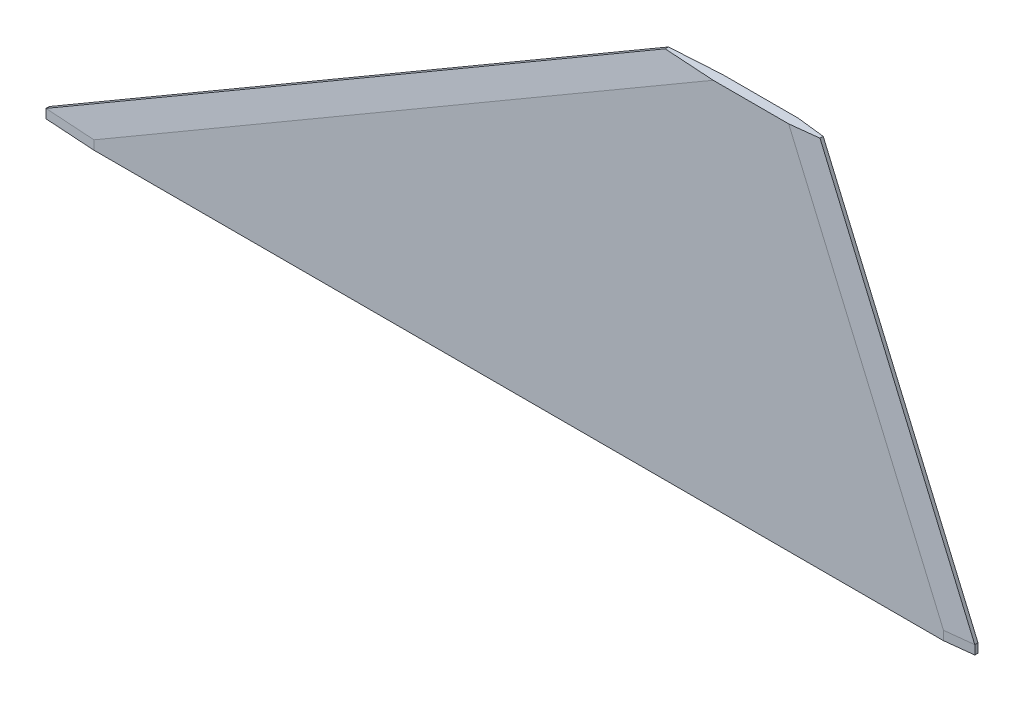
ISO-10303-21;
HEADER;
FILE_DESCRIPTION(('STEP AP214'),'2;1');
FILE_NAME('part.step','',(''),(''),'','','');
FILE_SCHEMA(('AUTOMOTIVE_DESIGN { 1 0 10303 214 1 1 1 1 }'));
ENDSEC;
DATA;
#1=APPLICATION_CONTEXT('core data for automotive mechanical design processes');
#2=APPLICATION_PROTOCOL_DEFINITION('international standard','automotive_design',2000,#1);
#3=PRODUCT_CONTEXT('',#1,'mechanical');
#4=PRODUCT('Part','Part','',(#3));
#5=PRODUCT_RELATED_PRODUCT_CATEGORY('part','',(#4));
#6=PRODUCT_DEFINITION_FORMATION('','',#4);
#7=PRODUCT_DEFINITION_CONTEXT('part definition',#1,'design');
#8=PRODUCT_DEFINITION('design','',#6,#7);
#9=PRODUCT_DEFINITION_SHAPE('','',#8);
#10=(LENGTH_UNIT() NAMED_UNIT(*) SI_UNIT(.MILLI.,.METRE.));
#11=(NAMED_UNIT(*) PLANE_ANGLE_UNIT() SI_UNIT($,.RADIAN.));
#12=(NAMED_UNIT(*) SI_UNIT($,.STERADIAN.) SOLID_ANGLE_UNIT());
#13=UNCERTAINTY_MEASURE_WITH_UNIT(LENGTH_MEASURE(1.E-05),#10,'distance_accuracy_value','');
#14=(GEOMETRIC_REPRESENTATION_CONTEXT(3) GLOBAL_UNCERTAINTY_ASSIGNED_CONTEXT((#13)) GLOBAL_UNIT_ASSIGNED_CONTEXT((#10,
#11,#12)) REPRESENTATION_CONTEXT('',''));
#15=CARTESIAN_POINT('',(0.,0.,0.));
#16=DIRECTION('',(0.,0.,1.));
#17=DIRECTION('',(1.,0.,0.));
#18=AXIS2_PLACEMENT_3D('',#15,#16,#17);
#19=CARTESIAN_POINT('',(304.8,177.8,4.7625));
#20=DIRECTION('',(0.503871025524086,-0.863778900898433,0.));
#21=DIRECTION('',(0.863778900898433,0.503871025524086,0.));
#22=AXIS2_PLACEMENT_3D('',#19,#20,#21);
#23=PLANE('',#22);
#24=DIRECTION('',(0.,0.,-1.));
#25=VECTOR('',#24,1.);
#26=CARTESIAN_POINT('',(304.8,177.8,4.7625));
#27=LINE('',#26,#25);
#28=CARTESIAN_POINT('',(304.8,177.8,3.17499999999999));
#29=VERTEX_POINT('',#28);
#30=CARTESIAN_POINT('',(304.8,177.8,1.5875));
#31=VERTEX_POINT('',#30);
#32=EDGE_CURVE('E158',#29,#31,#27,.T.);
#33=ORIENTED_EDGE('',*,*,#32,.T.);
#34=DIRECTION('',(-0.863778900898433,-0.503871025524086,0.));
#35=VECTOR('',#34,1.);
#36=CARTESIAN_POINT('',(0.,0.,1.5875));
#37=LINE('',#36,#35);
#38=CARTESIAN_POINT('',(0.,0.,1.5875));
#39=VERTEX_POINT('',#38);
#40=EDGE_CURVE('E172',#31,#39,#37,.T.);
#41=ORIENTED_EDGE('',*,*,#40,.T.);
#42=DIRECTION('',(0.,0.,-1.));
#43=VECTOR('',#42,1.);
#44=CARTESIAN_POINT('',(0.,0.,4.7625));
#45=LINE('',#44,#43);
#46=CARTESIAN_POINT('',(0.,0.,3.17499999999999));
#47=VERTEX_POINT('',#46);
#48=EDGE_CURVE('E167',#47,#39,#45,.T.);
#49=ORIENTED_EDGE('',*,*,#48,.F.);
#50=DIRECTION('',(0.863778900898433,0.503871025524086,0.));
#51=VECTOR('',#50,1.);
#52=CARTESIAN_POINT('',(304.8,177.8,3.17499999999999));
#53=LINE('',#52,#51);
#54=EDGE_CURVE('E170',#47,#29,#53,.T.);
#55=ORIENTED_EDGE('',*,*,#54,.T.);
#56=EDGE_LOOP('',(#33,#41,#49,#55));
#57=FACE_BOUND('',#56,.T.);
#58=ADVANCED_FACE('F38',(#57),#23,.F.);
#59=CARTESIAN_POINT('',(457.2,0.,4.7625));
#60=DIRECTION('',(-0.919145030018058,-0.393919298579168,0.));
#61=DIRECTION('',(0.393919298579168,-0.919145030018058,0.));
#62=AXIS2_PLACEMENT_3D('',#59,#60,#61);
#63=PLANE('',#62);
#64=DIRECTION('',(0.,0.,-1.));
#65=VECTOR('',#64,1.);
#66=CARTESIAN_POINT('',(457.2,0.,4.7625));
#67=LINE('',#66,#65);
#68=CARTESIAN_POINT('',(457.2,0.,3.17499999999998));
#69=VERTEX_POINT('',#68);
#70=CARTESIAN_POINT('',(457.2,0.,1.5875));
#71=VERTEX_POINT('',#70);
#72=EDGE_CURVE('E165',#69,#71,#67,.T.);
#73=ORIENTED_EDGE('',*,*,#72,.T.);
#74=DIRECTION('',(-0.393919298579168,0.919145030018058,0.));
#75=VECTOR('',#74,1.);
#76=CARTESIAN_POINT('',(381.,177.8,1.5875));
#77=LINE('',#76,#75);
#78=CARTESIAN_POINT('',(381.,177.8,1.5875));
#79=VERTEX_POINT('',#78);
#80=EDGE_CURVE('E191',#71,#79,#77,.T.);
#81=ORIENTED_EDGE('',*,*,#80,.T.);
#82=DIRECTION('',(0.,0.,-1.));
#83=VECTOR('',#82,1.);
#84=CARTESIAN_POINT('',(381.,177.8,4.7625));
#85=LINE('',#84,#83);
#86=CARTESIAN_POINT('',(381.,177.8,3.17499999999998));
#87=VERTEX_POINT('',#86);
#88=EDGE_CURVE('E162',#87,#79,#85,.T.);
#89=ORIENTED_EDGE('',*,*,#88,.F.);
#90=DIRECTION('',(0.393919298579168,-0.919145030018058,0.));
#91=VECTOR('',#90,1.);
#92=CARTESIAN_POINT('',(457.2,0.,3.17499999999998));
#93=LINE('',#92,#91);
#94=EDGE_CURVE('E189',#87,#69,#93,.T.);
#95=ORIENTED_EDGE('',*,*,#94,.T.);
#96=EDGE_LOOP('',(#73,#81,#89,#95));
#97=FACE_BOUND('',#96,.T.);
#98=ADVANCED_FACE('F267',(#97),#63,.F.);
#99=CARTESIAN_POINT('',(381.,177.8,4.7625));
#100=DIRECTION('',(0.,-1.,0.));
#101=DIRECTION('',(0.,0.,-1.));
#102=AXIS2_PLACEMENT_3D('',#99,#100,#101);
#103=PLANE('',#102);
#104=ORIENTED_EDGE('',*,*,#88,.T.);
#105=DIRECTION('',(-0.993464418144731,0.,-0.114142235304689));
#106=VECTOR('',#105,1.);
#107=CARTESIAN_POINT('',(456.207232119117,177.8,10.2282942029627));
#108=LINE('',#107,#106);
#109=CARTESIAN_POINT('',(367.18281165079,177.8,0.));
#110=VERTEX_POINT('',#109);
#111=EDGE_CURVE('E196',#79,#110,#108,.T.);
#112=ORIENTED_EDGE('',*,*,#111,.T.);
#113=DIRECTION('',(-1.,0.,0.));
#114=VECTOR('',#113,1.);
#115=CARTESIAN_POINT('',(381.,177.8,0.));
#116=LINE('',#115,#114);
#117=CARTESIAN_POINT('',(330.004862666573,177.8,0.));
#118=VERTEX_POINT('',#117);
#119=EDGE_CURVE('E150',#110,#118,#116,.T.);
#120=ORIENTED_EDGE('',*,*,#119,.T.);
#121=DIRECTION('',(-0.998022397418784,0.,0.0628593211104263));
#122=VECTOR('',#121,1.);
#123=CARTESIAN_POINT('',(304.8,177.8,1.5875));
#124=LINE('',#123,#122);
#125=EDGE_CURVE('E184',#118,#31,#124,.T.);
#126=ORIENTED_EDGE('',*,*,#125,.T.);
#127=ORIENTED_EDGE('',*,*,#32,.F.);
#128=DIRECTION('',(-0.998022397418784,0.,-0.0628593211104246));
#129=VECTOR('',#128,1.);
#130=CARTESIAN_POINT('',(7.67782336852167,177.8,-15.538906980656));
#131=LINE('',#130,#129);
#132=CARTESIAN_POINT('',(330.004862666574,177.8,4.7625));
#133=VERTEX_POINT('',#132);
#134=EDGE_CURVE('E181',#29,#133,#131,.F.);
#135=ORIENTED_EDGE('',*,*,#134,.T.);
#136=DIRECTION('',(-1.,0.,0.));
#137=VECTOR('',#136,1.);
#138=CARTESIAN_POINT('',(381.,177.8,4.7625));
#139=LINE('',#138,#137);
#140=CARTESIAN_POINT('',(367.182811650789,177.8,4.7625));
#141=VERTEX_POINT('',#140);
#142=EDGE_CURVE('E152',#141,#133,#139,.T.);
#143=ORIENTED_EDGE('',*,*,#142,.F.);
#144=DIRECTION('',(-0.993464418144731,0.,0.114142235304686));
#145=VECTOR('',#144,1.);
#146=CARTESIAN_POINT('',(374.485630180208,177.8,3.9234563304451));
#147=LINE('',#146,#145);
#148=EDGE_CURVE('E194',#141,#87,#147,.F.);
#149=ORIENTED_EDGE('',*,*,#148,.T.);
#150=EDGE_LOOP('',(#104,#112,#120,#126,#127,#135,#143,#149));
#151=FACE_BOUND('',#150,.T.);
#152=ADVANCED_FACE('F260',(#151),#103,.F.);
#153=CARTESIAN_POINT('',(0.,0.,4.7625));
#154=DIRECTION('',(0.,0.,-1.));
#155=DIRECTION('',(-1.,0.,0.));
#156=AXIS2_PLACEMENT_3D('',#153,#154,#155);
#157=PLANE('',#156);
#158=DIRECTION('',(-0.863778900898433,-0.503871025524086,0.));
#159=VECTOR('',#158,1.);
#160=CARTESIAN_POINT('',(6.39916202415609,-10.9699920414104,4.7625));
#161=LINE('',#160,#159);
#162=CARTESIAN_POINT('',(25.204862666574,0.,4.7625));
#163=VERTEX_POINT('',#162);
#164=EDGE_CURVE('E186',#133,#163,#161,.T.);
#165=ORIENTED_EDGE('',*,*,#164,.T.);
#166=DIRECTION('',(0.,1.,0.));
#167=VECTOR('',#166,1.);
#168=CARTESIAN_POINT('',(25.204862666574,-4.445,4.7625));
#169=LINE('',#168,#167);
#170=CARTESIAN_POINT('',(25.204862666574,-4.445,4.7625));
#171=VERTEX_POINT('',#170);
#172=EDGE_CURVE('E220',#171,#163,#169,.T.);
#173=ORIENTED_EDGE('',*,*,#172,.F.);
#174=DIRECTION('',(-1.,0.,0.));
#175=VECTOR('',#174,1.);
#176=CARTESIAN_POINT('',(443.382811650789,-4.445,4.7625));
#177=LINE('',#176,#175);
#178=CARTESIAN_POINT('',(443.382811650789,-4.445,4.7625));
#179=VERTEX_POINT('',#178);
#180=EDGE_CURVE('E231',#179,#171,#177,.T.);
#181=ORIENTED_EDGE('',*,*,#180,.F.);
#182=DIRECTION('',(0.,1.,0.));
#183=VECTOR('',#182,1.);
#184=CARTESIAN_POINT('',(443.382811650789,-4.445,4.7625));
#185=LINE('',#184,#183);
#186=CARTESIAN_POINT('',(443.382811650789,0.,4.7625));
#187=VERTEX_POINT('',#186);
#188=EDGE_CURVE('E215',#179,#187,#185,.T.);
#189=ORIENTED_EDGE('',*,*,#188,.T.);
#190=DIRECTION('',(-0.393919298579168,0.919145030018058,0.));
#191=VECTOR('',#190,1.);
#192=CARTESIAN_POINT('',(374.582030532563,160.535155942527,4.7625));
#193=LINE('',#192,#191);
#194=EDGE_CURVE('E11',#187,#141,#193,.T.);
#195=ORIENTED_EDGE('',*,*,#194,.T.);
#196=ORIENTED_EDGE('',*,*,#142,.T.);
#197=EDGE_LOOP('',(#165,#173,#181,#189,#195,#196));
#198=FACE_BOUND('',#197,.T.);
#199=ADVANCED_FACE('F243',(#198),#157,.F.);
#200=CARTESIAN_POINT('',(0.,0.,0.));
#201=DIRECTION('',(0.,0.,-1.));
#202=DIRECTION('',(-1.,0.,0.));
#203=AXIS2_PLACEMENT_3D('',#200,#201,#202);
#204=PLANE('',#203);
#205=ORIENTED_EDGE('',*,*,#119,.F.);
#206=DIRECTION('',(0.393919298579168,-0.919145030018058,0.));
#207=VECTOR('',#206,1.);
#208=CARTESIAN_POINT('',(445.526858118771,-5.00277509195542,0.));
#209=LINE('',#208,#207);
#210=CARTESIAN_POINT('',(443.38281165079,0.,0.));
#211=VERTEX_POINT('',#210);
#212=EDGE_CURVE('E59',#110,#211,#209,.T.);
#213=ORIENTED_EDGE('',*,*,#212,.T.);
#214=DIRECTION('',(0.,1.,0.));
#215=VECTOR('',#214,1.);
#216=CARTESIAN_POINT('',(443.38281165079,-4.445,0.));
#217=LINE('',#216,#215);
#218=CARTESIAN_POINT('',(443.38281165079,-4.445,0.));
#219=VERTEX_POINT('',#218);
#220=EDGE_CURVE('E134',#219,#211,#217,.T.);
#221=ORIENTED_EDGE('',*,*,#220,.F.);
#222=DIRECTION('',(1.,0.,0.));
#223=VECTOR('',#222,1.);
#224=CARTESIAN_POINT('',(25.2048626665733,-4.445,0.));
#225=LINE('',#224,#223);
#226=CARTESIAN_POINT('',(25.2048626665733,-4.445,0.));
#227=VERTEX_POINT('',#226);
#228=EDGE_CURVE('E126',#227,#219,#225,.T.);
#229=ORIENTED_EDGE('',*,*,#228,.F.);
#230=DIRECTION('',(0.,1.,0.));
#231=VECTOR('',#230,1.);
#232=CARTESIAN_POINT('',(25.2048626665733,-4.445,0.));
#233=LINE('',#232,#231);
#234=CARTESIAN_POINT('',(25.2048626665733,0.,0.));
#235=VERTEX_POINT('',#234);
#236=EDGE_CURVE('E131',#227,#235,#233,.T.);
#237=ORIENTED_EDGE('',*,*,#236,.T.);
#238=DIRECTION('',(0.863778900898433,0.503871025524086,0.));
#239=VECTOR('',#238,1.);
#240=CARTESIAN_POINT('',(311.199162024156,166.83000795859,0.));
#241=LINE('',#240,#239);
#242=EDGE_CURVE('E179',#235,#118,#241,.T.);
#243=ORIENTED_EDGE('',*,*,#242,.T.);
#244=EDGE_LOOP('',(#205,#213,#221,#229,#237,#243));
#245=FACE_BOUND('',#244,.T.);
#246=ADVANCED_FACE('F128',(#245),#204,.T.);
#247=CARTESIAN_POINT('',(304.8,177.8,1.5875));
#248=DIRECTION('',(-0.0624975089180724,0.107138586716695,-0.992277876713668));
#249=DIRECTION('',(0.863778900898433,0.503871025524086,0.));
#250=AXIS2_PLACEMENT_3D('',#247,#248,#249);
#251=PLANE('',#250);
#252=ORIENTED_EDGE('',*,*,#125,.F.);
#253=ORIENTED_EDGE('',*,*,#242,.F.);
#254=DIRECTION('',(0.998022397418784,0.,-0.0628593211104263));
#255=VECTOR('',#254,1.);
#256=CARTESIAN_POINT('',(303.595645512459,0.,-17.5341311561262));
#257=LINE('',#256,#255);
#258=EDGE_CURVE('E149',#39,#235,#257,.T.);
#259=ORIENTED_EDGE('',*,*,#258,.F.);
#260=ORIENTED_EDGE('',*,*,#40,.F.);
#261=EDGE_LOOP('',(#252,#253,#259,#260));
#262=FACE_BOUND('',#261,.T.);
#263=ADVANCED_FACE('F263',(#262),#251,.T.);
#264=CARTESIAN_POINT('',(6.39916202415609,-10.9699920414104,4.7625));
#265=DIRECTION('',(0.0624975089180707,-0.107138586716693,-0.992277876713668));
#266=DIRECTION('',(-0.863778900898433,-0.503871025524086,0.));
#267=AXIS2_PLACEMENT_3D('',#264,#265,#266);
#268=PLANE('',#267);
#269=ORIENTED_EDGE('',*,*,#134,.F.);
#270=ORIENTED_EDGE('',*,*,#54,.F.);
#271=DIRECTION('',(0.998022397418784,0.,0.0628593211104246));
#272=VECTOR('',#271,1.);
#273=CARTESIAN_POINT('',(6.47346888098041,0.,3.58272417546972));
#274=LINE('',#273,#272);
#275=EDGE_CURVE('E175',#163,#47,#274,.F.);
#276=ORIENTED_EDGE('',*,*,#275,.F.);
#277=ORIENTED_EDGE('',*,*,#164,.F.);
#278=EDGE_LOOP('',(#269,#270,#276,#277));
#279=FACE_BOUND('',#278,.T.);
#280=ADVANCED_FACE('F256',(#279),#268,.F.);
#281=CARTESIAN_POINT('',(457.2,0.,1.5875));
#282=DIRECTION('',(0.11400590984728,0.0488596756488344,-0.992277876713668));
#283=DIRECTION('',(0.393919298579168,-0.919145030018058,0.));
#284=AXIS2_PLACEMENT_3D('',#281,#282,#283);
#285=PLANE('',#284);
#286=DIRECTION('',(0.993464418144731,0.,0.114142235304689));
#287=VECTOR('',#286,1.);
#288=CARTESIAN_POINT('',(457.2,0.,1.5875));
#289=LINE('',#288,#287);
#290=EDGE_CURVE('E46',#211,#71,#289,.T.);
#291=ORIENTED_EDGE('',*,*,#290,.F.);
#292=ORIENTED_EDGE('',*,*,#212,.F.);
#293=ORIENTED_EDGE('',*,*,#111,.F.);
#294=ORIENTED_EDGE('',*,*,#80,.F.);
#295=EDGE_LOOP('',(#291,#292,#293,#294));
#296=FACE_BOUND('',#295,.T.);
#297=ADVANCED_FACE('F264',(#296),#285,.T.);
#298=CARTESIAN_POINT('',(374.582030532563,160.535155942527,4.7625));
#299=DIRECTION('',(-0.114005909847277,-0.0488596756488329,-0.992277876713668));
#300=DIRECTION('',(-0.393919298579168,0.919145030018058,0.));
#301=AXIS2_PLACEMENT_3D('',#298,#299,#300);
#302=PLANE('',#301);
#303=DIRECTION('',(0.993464418144731,0.,-0.114142235304686));
#304=VECTOR('',#303,1.);
#305=CARTESIAN_POINT('',(375.478398061091,0.,12.5642505334075));
#306=LINE('',#305,#304);
#307=EDGE_CURVE('E199',#69,#187,#306,.F.);
#308=ORIENTED_EDGE('',*,*,#307,.F.);
#309=ORIENTED_EDGE('',*,*,#94,.F.);
#310=ORIENTED_EDGE('',*,*,#148,.F.);
#311=ORIENTED_EDGE('',*,*,#194,.F.);
#312=EDGE_LOOP('',(#308,#309,#310,#311));
#313=FACE_BOUND('',#312,.T.);
#314=ADVANCED_FACE('F40',(#313),#302,.F.);
#315=CARTESIAN_POINT('',(0.,-4.445,1.5875));
#316=DIRECTION('',(0.0628593211104259,0.,0.998022397418784));
#317=DIRECTION('',(0.998022397418784,0.,-0.0628593211104259));
#318=AXIS2_PLACEMENT_3D('',#315,#316,#317);
#319=PLANE('',#318);
#320=ORIENTED_EDGE('',*,*,#258,.T.);
#321=ORIENTED_EDGE('',*,*,#236,.F.);
#322=DIRECTION('',(0.998022397418784,0.,-0.0628593211104259));
#323=VECTOR('',#322,1.);
#324=CARTESIAN_POINT('',(0.,-4.445,1.5875));
#325=LINE('',#324,#323);
#326=CARTESIAN_POINT('',(0.,-4.445,1.5875));
#327=VERTEX_POINT('',#326);
#328=EDGE_CURVE('E138',#327,#227,#325,.T.);
#329=ORIENTED_EDGE('',*,*,#328,.F.);
#330=DIRECTION('',(0.,1.,0.));
#331=VECTOR('',#330,1.);
#332=CARTESIAN_POINT('',(0.,-4.445,1.5875));
#333=LINE('',#332,#331);
#334=EDGE_CURVE('E226',#327,#39,#333,.T.);
#335=ORIENTED_EDGE('',*,*,#334,.T.);
#336=EDGE_LOOP('',(#320,#321,#329,#335));
#337=FACE_BOUND('',#336,.T.);
#338=ADVANCED_FACE('F148',(#337),#319,.F.);
#339=CARTESIAN_POINT('',(443.38281165079,-4.445,0.));
#340=DIRECTION('',(-0.114142235304689,0.,0.993464418144731));
#341=DIRECTION('',(0.993464418144731,0.,0.114142235304689));
#342=AXIS2_PLACEMENT_3D('',#339,#340,#341);
#343=PLANE('',#342);
#344=ORIENTED_EDGE('',*,*,#290,.T.);
#345=DIRECTION('',(0.,1.,0.));
#346=VECTOR('',#345,1.);
#347=CARTESIAN_POINT('',(457.2,-4.445,1.5875));
#348=LINE('',#347,#346);
#349=CARTESIAN_POINT('',(457.2,-4.445,1.5875));
#350=VERTEX_POINT('',#349);
#351=EDGE_CURVE('E154',#350,#71,#348,.T.);
#352=ORIENTED_EDGE('',*,*,#351,.F.);
#353=DIRECTION('',(0.993464418144731,0.,0.114142235304689));
#354=VECTOR('',#353,1.);
#355=CARTESIAN_POINT('',(443.38281165079,-4.445,0.));
#356=LINE('',#355,#354);
#357=EDGE_CURVE('E137',#219,#350,#356,.T.);
#358=ORIENTED_EDGE('',*,*,#357,.F.);
#359=ORIENTED_EDGE('',*,*,#220,.T.);
#360=EDGE_LOOP('',(#344,#352,#358,#359));
#361=FACE_BOUND('',#360,.T.);
#362=ADVANCED_FACE('F204',(#361),#343,.F.);
#363=CARTESIAN_POINT('',(457.2,-4.445,1.5875));
#364=DIRECTION('',(-1.,0.,0.));
#365=DIRECTION('',(0.,0.,1.));
#366=AXIS2_PLACEMENT_3D('',#363,#364,#365);
#367=PLANE('',#366);
#368=ORIENTED_EDGE('',*,*,#72,.F.);
#369=DIRECTION('',(0.,1.,0.));
#370=VECTOR('',#369,1.);
#371=CARTESIAN_POINT('',(457.2,-4.445,3.17499999999998));
#372=LINE('',#371,#370);
#373=CARTESIAN_POINT('',(457.2,-4.445,3.17499999999998));
#374=VERTEX_POINT('',#373);
#375=EDGE_CURVE('E214',#374,#69,#372,.T.);
#376=ORIENTED_EDGE('',*,*,#375,.F.);
#377=DIRECTION('',(0.,0.,1.));
#378=VECTOR('',#377,1.);
#379=CARTESIAN_POINT('',(457.2,-4.445,1.5875));
#380=LINE('',#379,#378);
#381=EDGE_CURVE('E213',#350,#374,#380,.T.);
#382=ORIENTED_EDGE('',*,*,#381,.F.);
#383=ORIENTED_EDGE('',*,*,#351,.T.);
#384=EDGE_LOOP('',(#368,#376,#382,#383));
#385=FACE_BOUND('',#384,.T.);
#386=ADVANCED_FACE('F210',(#385),#367,.F.);
#387=CARTESIAN_POINT('',(457.2,-4.445,3.17499999999998));
#388=DIRECTION('',(-0.114142235304686,0.,-0.993464418144731));
#389=DIRECTION('',(-0.993464418144732,0.,0.114142235304686));
#390=AXIS2_PLACEMENT_3D('',#387,#388,#389);
#391=PLANE('',#390);
#392=ORIENTED_EDGE('',*,*,#307,.T.);
#393=ORIENTED_EDGE('',*,*,#188,.F.);
#394=DIRECTION('',(-0.993464418144731,0.,0.114142235304686));
#395=VECTOR('',#394,1.);
#396=CARTESIAN_POINT('',(457.2,-4.445,3.17499999999998));
#397=LINE('',#396,#395);
#398=EDGE_CURVE('E233',#374,#179,#397,.T.);
#399=ORIENTED_EDGE('',*,*,#398,.F.);
#400=ORIENTED_EDGE('',*,*,#375,.T.);
#401=EDGE_LOOP('',(#392,#393,#399,#400));
#402=FACE_BOUND('',#401,.T.);
#403=ADVANCED_FACE('F239',(#402),#391,.F.);
#404=CARTESIAN_POINT('',(25.204862666574,-4.445,4.7625));
#405=DIRECTION('',(0.0628593211104246,0.,-0.998022397418784));
#406=DIRECTION('',(-0.998022397418784,0.,-0.0628593211104246));
#407=AXIS2_PLACEMENT_3D('',#404,#405,#406);
#408=PLANE('',#407);
#409=ORIENTED_EDGE('',*,*,#275,.T.);
#410=DIRECTION('',(0.,1.,0.));
#411=VECTOR('',#410,1.);
#412=CARTESIAN_POINT('',(0.,-4.445,3.17499999999999));
#413=LINE('',#412,#411);
#414=CARTESIAN_POINT('',(0.,-4.445,3.17499999999999));
#415=VERTEX_POINT('',#414);
#416=EDGE_CURVE('E223',#415,#47,#413,.T.);
#417=ORIENTED_EDGE('',*,*,#416,.F.);
#418=DIRECTION('',(-0.998022397418784,0.,-0.0628593211104246));
#419=VECTOR('',#418,1.);
#420=CARTESIAN_POINT('',(25.204862666574,-4.445,4.7625));
#421=LINE('',#420,#419);
#422=EDGE_CURVE('E229',#171,#415,#421,.T.);
#423=ORIENTED_EDGE('',*,*,#422,.F.);
#424=ORIENTED_EDGE('',*,*,#172,.T.);
#425=EDGE_LOOP('',(#409,#417,#423,#424));
#426=FACE_BOUND('',#425,.T.);
#427=ADVANCED_FACE('F247',(#426),#408,.F.);
#428=CARTESIAN_POINT('',(0.,-4.445,3.17499999999999));
#429=DIRECTION('',(1.,0.,0.));
#430=DIRECTION('',(0.,0.,-1.));
#431=AXIS2_PLACEMENT_3D('',#428,#429,#430);
#432=PLANE('',#431);
#433=ORIENTED_EDGE('',*,*,#48,.T.);
#434=ORIENTED_EDGE('',*,*,#334,.F.);
#435=DIRECTION('',(0.,0.,-1.));
#436=VECTOR('',#435,1.);
#437=CARTESIAN_POINT('',(0.,-4.445,3.17499999999999));
#438=LINE('',#437,#436);
#439=EDGE_CURVE('E143',#415,#327,#438,.T.);
#440=ORIENTED_EDGE('',*,*,#439,.F.);
#441=ORIENTED_EDGE('',*,*,#416,.T.);
#442=EDGE_LOOP('',(#433,#434,#440,#441));
#443=FACE_BOUND('',#442,.T.);
#444=ADVANCED_FACE('F249',(#443),#432,.F.);
#445=CARTESIAN_POINT('',(0.,-4.445,0.));
#446=DIRECTION('',(0.,-1.,0.));
#447=DIRECTION('',(0.,0.,-1.));
#448=AXIS2_PLACEMENT_3D('',#445,#446,#447);
#449=PLANE('',#448);
#450=ORIENTED_EDGE('',*,*,#328,.T.);
#451=ORIENTED_EDGE('',*,*,#228,.T.);
#452=ORIENTED_EDGE('',*,*,#357,.T.);
#453=ORIENTED_EDGE('',*,*,#381,.T.);
#454=ORIENTED_EDGE('',*,*,#398,.T.);
#455=ORIENTED_EDGE('',*,*,#180,.T.);
#456=ORIENTED_EDGE('',*,*,#422,.T.);
#457=ORIENTED_EDGE('',*,*,#439,.T.);
#458=EDGE_LOOP('',(#450,#451,#452,#453,#454,#455,#456,#457));
#459=FACE_BOUND('',#458,.T.);
#460=ADVANCED_FACE('F141',(#459),#449,.T.);
#461=CLOSED_SHELL('',(#58,#98,#152,#199,#246,#263,#280,#297,#314,#338,#362,#386,#403,#427,#444,#460));
#462=MANIFOLD_SOLID_BREP('B2',#461);
#463=ADVANCED_BREP_SHAPE_REPRESENTATION('',(#18,#462),#14);
#464=SHAPE_DEFINITION_REPRESENTATION(#9,#463);
ENDSEC;
END-ISO-10303-21;
